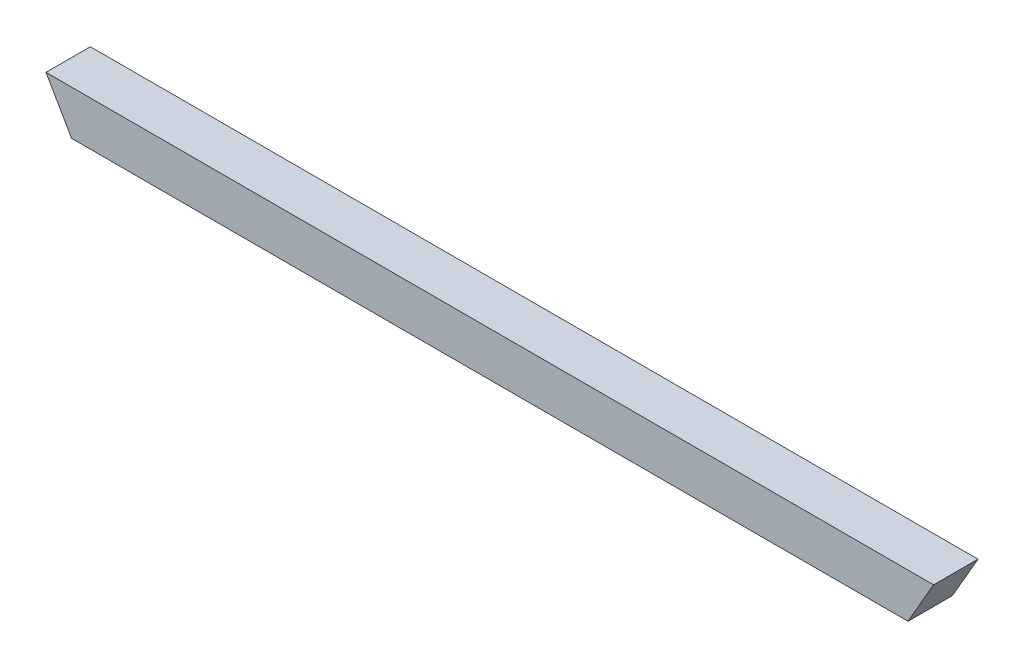
ISO-10303-21;
HEADER;
FILE_DESCRIPTION(('STEP AP214'),'2;1');
FILE_NAME('part.step','',(''),(''),'','','');
FILE_SCHEMA(('AUTOMOTIVE_DESIGN { 1 0 10303 214 1 1 1 1 }'));
ENDSEC;
DATA;
#1=APPLICATION_CONTEXT('core data for automotive mechanical design processes');
#2=APPLICATION_PROTOCOL_DEFINITION('international standard','automotive_design',2000,#1);
#3=PRODUCT_CONTEXT('',#1,'mechanical');
#4=PRODUCT('Part','Part','',(#3));
#5=PRODUCT_RELATED_PRODUCT_CATEGORY('part','',(#4));
#6=PRODUCT_DEFINITION_FORMATION('','',#4);
#7=PRODUCT_DEFINITION_CONTEXT('part definition',#1,'design');
#8=PRODUCT_DEFINITION('design','',#6,#7);
#9=PRODUCT_DEFINITION_SHAPE('','',#8);
#10=(LENGTH_UNIT() NAMED_UNIT(*) SI_UNIT(.MILLI.,.METRE.));
#11=(NAMED_UNIT(*) PLANE_ANGLE_UNIT() SI_UNIT($,.RADIAN.));
#12=(NAMED_UNIT(*) SI_UNIT($,.STERADIAN.) SOLID_ANGLE_UNIT());
#13=UNCERTAINTY_MEASURE_WITH_UNIT(LENGTH_MEASURE(1.E-05),#10,'distance_accuracy_value','');
#14=(GEOMETRIC_REPRESENTATION_CONTEXT(3) GLOBAL_UNCERTAINTY_ASSIGNED_CONTEXT((#13)) GLOBAL_UNIT_ASSIGNED_CONTEXT((#10,
#11,#12)) REPRESENTATION_CONTEXT('',''));
#15=CARTESIAN_POINT('',(0.,0.,0.));
#16=DIRECTION('',(0.,0.,1.));
#17=DIRECTION('',(1.,0.,0.));
#18=AXIS2_PLACEMENT_3D('',#15,#16,#17);
#19=CARTESIAN_POINT('',(200.,0.,20.));
#20=DIRECTION('',(-0.866025403784439,0.5,0.));
#21=DIRECTION('',(-0.5,-0.866025403784439,0.));
#22=AXIS2_PLACEMENT_3D('',#19,#20,#21);
#23=PLANE('',#22);
#24=DIRECTION('',(0.5,0.866025403784439,0.));
#25=VECTOR('',#24,1.);
#26=CARTESIAN_POINT('',(200.,0.,0.));
#27=LINE('',#26,#25);
#28=CARTESIAN_POINT('',(188.452994616208,-19.9999999999998,0.));
#29=VERTEX_POINT('',#28);
#30=CARTESIAN_POINT('',(200.,0.,0.));
#31=VERTEX_POINT('',#30);
#32=EDGE_CURVE('E96',#29,#31,#27,.T.);
#33=ORIENTED_EDGE('',*,*,#32,.T.);
#34=DIRECTION('',(0.,0.,-1.));
#35=VECTOR('',#34,1.);
#36=CARTESIAN_POINT('',(200.,0.,20.));
#37=LINE('',#36,#35);
#38=CARTESIAN_POINT('',(200.,0.,20.));
#39=VERTEX_POINT('',#38);
#40=EDGE_CURVE('E11',#39,#31,#37,.T.);
#41=ORIENTED_EDGE('',*,*,#40,.F.);
#42=DIRECTION('',(0.5,0.866025403784439,0.));
#43=VECTOR('',#42,1.);
#44=CARTESIAN_POINT('',(200.,0.,20.));
#45=LINE('',#44,#43);
#46=CARTESIAN_POINT('',(188.452994616208,-19.9999999999998,20.));
#47=VERTEX_POINT('',#46);
#48=EDGE_CURVE('E84',#47,#39,#45,.T.);
#49=ORIENTED_EDGE('',*,*,#48,.F.);
#50=DIRECTION('',(0.,0.,-1.));
#51=VECTOR('',#50,1.);
#52=CARTESIAN_POINT('',(188.452994616208,-19.9999999999998,20.));
#53=LINE('',#52,#51);
#54=EDGE_CURVE('E92',#47,#29,#53,.T.);
#55=ORIENTED_EDGE('',*,*,#54,.T.);
#56=EDGE_LOOP('',(#33,#41,#49,#55));
#57=FACE_BOUND('',#56,.T.);
#58=ADVANCED_FACE('F33',(#57),#23,.F.);
#59=CARTESIAN_POINT('',(-200.,0.,20.));
#60=DIRECTION('',(0.,-1.,0.));
#61=DIRECTION('',(1.,0.,0.));
#62=AXIS2_PLACEMENT_3D('',#59,#60,#61);
#63=PLANE('',#62);
#64=DIRECTION('',(-1.,0.,0.));
#65=VECTOR('',#64,1.);
#66=CARTESIAN_POINT('',(-200.,0.,0.));
#67=LINE('',#66,#65);
#68=CARTESIAN_POINT('',(-200.,0.,0.));
#69=VERTEX_POINT('',#68);
#70=EDGE_CURVE('E88',#31,#69,#67,.T.);
#71=ORIENTED_EDGE('',*,*,#70,.T.);
#72=DIRECTION('',(0.,0.,-1.));
#73=VECTOR('',#72,1.);
#74=CARTESIAN_POINT('',(-200.,0.,20.));
#75=LINE('',#74,#73);
#76=CARTESIAN_POINT('',(-200.,0.,20.));
#77=VERTEX_POINT('',#76);
#78=EDGE_CURVE('E41',#77,#69,#75,.T.);
#79=ORIENTED_EDGE('',*,*,#78,.F.);
#80=DIRECTION('',(-1.,0.,0.));
#81=VECTOR('',#80,1.);
#82=CARTESIAN_POINT('',(-200.,0.,20.));
#83=LINE('',#82,#81);
#84=EDGE_CURVE('E79',#39,#77,#83,.T.);
#85=ORIENTED_EDGE('',*,*,#84,.F.);
#86=ORIENTED_EDGE('',*,*,#40,.T.);
#87=EDGE_LOOP('',(#71,#79,#85,#86));
#88=FACE_BOUND('',#87,.T.);
#89=ADVANCED_FACE('F87',(#88),#63,.F.);
#90=CARTESIAN_POINT('',(-200.,0.,20.));
#91=DIRECTION('',(0.86602540378444,0.499999999999998,0.));
#92=DIRECTION('',(-0.499999999999998,0.86602540378444,0.));
#93=AXIS2_PLACEMENT_3D('',#90,#91,#92);
#94=PLANE('',#93);
#95=DIRECTION('',(0.499999999999998,-0.86602540378444,0.));
#96=VECTOR('',#95,1.);
#97=CARTESIAN_POINT('',(-200.,0.,0.));
#98=LINE('',#97,#96);
#99=CARTESIAN_POINT('',(-188.452994616208,-20.,0.));
#100=VERTEX_POINT('',#99);
#101=EDGE_CURVE('E66',#69,#100,#98,.T.);
#102=ORIENTED_EDGE('',*,*,#101,.T.);
#103=DIRECTION('',(0.,0.,-1.));
#104=VECTOR('',#103,1.);
#105=CARTESIAN_POINT('',(-188.452994616208,-20.,20.));
#106=LINE('',#105,#104);
#107=CARTESIAN_POINT('',(-188.452994616208,-20.,20.));
#108=VERTEX_POINT('',#107);
#109=EDGE_CURVE('E89',#108,#100,#106,.T.);
#110=ORIENTED_EDGE('',*,*,#109,.F.);
#111=DIRECTION('',(0.499999999999998,-0.86602540378444,0.));
#112=VECTOR('',#111,1.);
#113=CARTESIAN_POINT('',(-200.,0.,20.));
#114=LINE('',#113,#112);
#115=EDGE_CURVE('E82',#77,#108,#114,.T.);
#116=ORIENTED_EDGE('',*,*,#115,.F.);
#117=ORIENTED_EDGE('',*,*,#78,.T.);
#118=EDGE_LOOP('',(#102,#110,#116,#117));
#119=FACE_BOUND('',#118,.T.);
#120=ADVANCED_FACE('F90',(#119),#94,.F.);
#121=CARTESIAN_POINT('',(188.452994616208,-19.9999999999998,20.));
#122=DIRECTION('',(0.,1.,0.));
#123=DIRECTION('',(-1.,0.,0.));
#124=AXIS2_PLACEMENT_3D('',#121,#122,#123);
#125=PLANE('',#124);
#126=DIRECTION('',(1.,0.,0.));
#127=VECTOR('',#126,1.);
#128=CARTESIAN_POINT('',(188.452994616208,-19.9999999999998,0.));
#129=LINE('',#128,#127);
#130=EDGE_CURVE('E72',#100,#29,#129,.T.);
#131=ORIENTED_EDGE('',*,*,#130,.T.);
#132=ORIENTED_EDGE('',*,*,#54,.F.);
#133=DIRECTION('',(1.,0.,0.));
#134=VECTOR('',#133,1.);
#135=CARTESIAN_POINT('',(188.452994616208,-19.9999999999998,20.));
#136=LINE('',#135,#134);
#137=EDGE_CURVE('E49',#108,#47,#136,.T.);
#138=ORIENTED_EDGE('',*,*,#137,.F.);
#139=ORIENTED_EDGE('',*,*,#109,.T.);
#140=EDGE_LOOP('',(#131,#132,#138,#139));
#141=FACE_BOUND('',#140,.T.);
#142=ADVANCED_FACE('F103',(#141),#125,.F.);
#143=CARTESIAN_POINT('',(0.,0.,20.));
#144=DIRECTION('',(0.,0.,-1.));
#145=DIRECTION('',(-1.,0.,0.));
#146=AXIS2_PLACEMENT_3D('',#143,#144,#145);
#147=PLANE('',#146);
#148=ORIENTED_EDGE('',*,*,#48,.T.);
#149=ORIENTED_EDGE('',*,*,#84,.T.);
#150=ORIENTED_EDGE('',*,*,#115,.T.);
#151=ORIENTED_EDGE('',*,*,#137,.T.);
#152=EDGE_LOOP('',(#148,#149,#150,#151));
#153=FACE_BOUND('',#152,.T.);
#154=ADVANCED_FACE('F80',(#153),#147,.F.);
#155=CARTESIAN_POINT('',(0.,0.,0.));
#156=DIRECTION('',(0.,0.,-1.));
#157=DIRECTION('',(-1.,0.,0.));
#158=AXIS2_PLACEMENT_3D('',#155,#156,#157);
#159=PLANE('',#158);
#160=ORIENTED_EDGE('',*,*,#32,.F.);
#161=ORIENTED_EDGE('',*,*,#130,.F.);
#162=ORIENTED_EDGE('',*,*,#101,.F.);
#163=ORIENTED_EDGE('',*,*,#70,.F.);
#164=EDGE_LOOP('',(#160,#161,#162,#163));
#165=FACE_BOUND('',#164,.T.);
#166=ADVANCED_FACE('F106',(#165),#159,.T.);
#167=CLOSED_SHELL('',(#58,#89,#120,#142,#154,#166));
#168=MANIFOLD_SOLID_BREP('B2',#167);
#169=ADVANCED_BREP_SHAPE_REPRESENTATION('',(#18,#168),#14);
#170=SHAPE_DEFINITION_REPRESENTATION(#9,#169);
ENDSEC;
END-ISO-10303-21;
